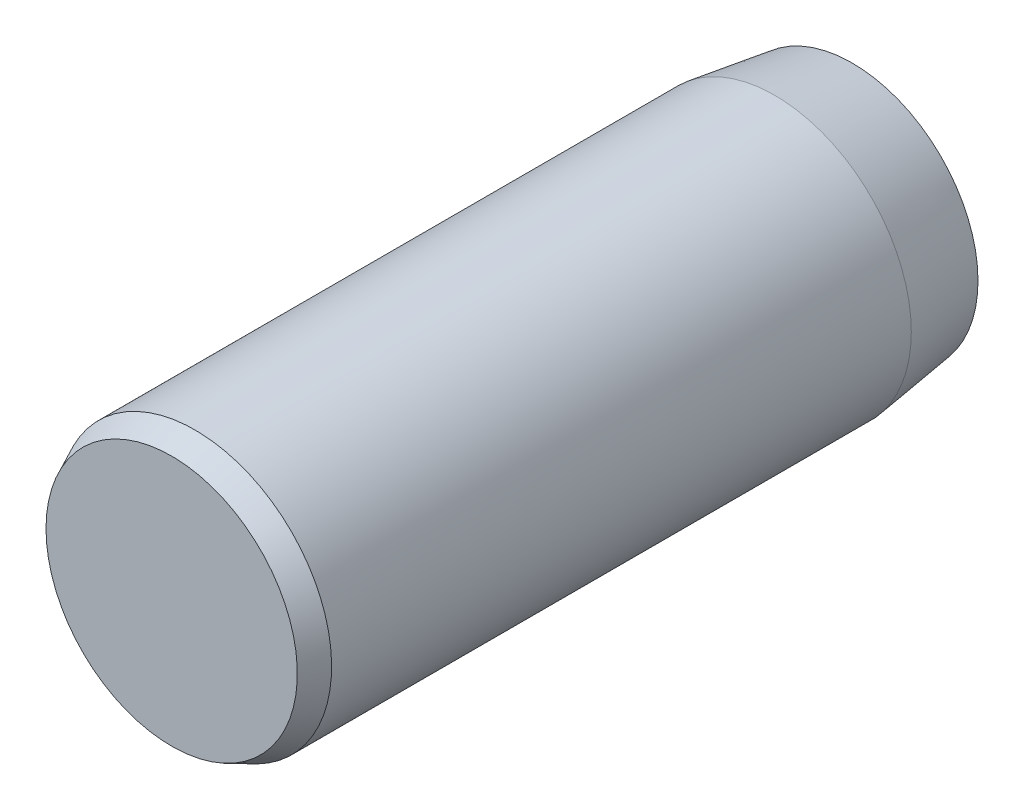
ISO-10303-21;
HEADER;
FILE_DESCRIPTION(('STEP AP214'),'2;1');
FILE_NAME('part.step','',(''),(''),'','','');
FILE_SCHEMA(('AUTOMOTIVE_DESIGN { 1 0 10303 214 1 1 1 1 }'));
ENDSEC;
DATA;
#1=APPLICATION_CONTEXT('core data for automotive mechanical design processes');
#2=APPLICATION_PROTOCOL_DEFINITION('international standard','automotive_design',2000,#1);
#3=PRODUCT_CONTEXT('',#1,'mechanical');
#4=PRODUCT('Part','Part','',(#3));
#5=PRODUCT_RELATED_PRODUCT_CATEGORY('part','',(#4));
#6=PRODUCT_DEFINITION_FORMATION('','',#4);
#7=PRODUCT_DEFINITION_CONTEXT('part definition',#1,'design');
#8=PRODUCT_DEFINITION('design','',#6,#7);
#9=PRODUCT_DEFINITION_SHAPE('','',#8);
#10=(LENGTH_UNIT() NAMED_UNIT(*) SI_UNIT(.MILLI.,.METRE.));
#11=(NAMED_UNIT(*) PLANE_ANGLE_UNIT() SI_UNIT($,.RADIAN.));
#12=(NAMED_UNIT(*) SI_UNIT($,.STERADIAN.) SOLID_ANGLE_UNIT());
#13=UNCERTAINTY_MEASURE_WITH_UNIT(LENGTH_MEASURE(1.E-05),#10,'distance_accuracy_value','');
#14=(GEOMETRIC_REPRESENTATION_CONTEXT(3) GLOBAL_UNCERTAINTY_ASSIGNED_CONTEXT((#13)) GLOBAL_UNIT_ASSIGNED_CONTEXT((#10,
#11,#12)) REPRESENTATION_CONTEXT('',''));
#15=CARTESIAN_POINT('',(0.,0.,0.));
#16=DIRECTION('',(0.,0.,1.));
#17=DIRECTION('',(1.,0.,0.));
#18=AXIS2_PLACEMENT_3D('',#15,#16,#17);
#19=CARTESIAN_POINT('',(0.,0.,0.));
#20=DIRECTION('',(0.,0.,1.));
#21=DIRECTION('',(1.,0.,0.));
#22=AXIS2_PLACEMENT_3D('',#19,#20,#21);
#23=PLANE('',#22);
#24=CARTESIAN_POINT('',(0.,0.,1.13686946141833E-10));
#25=DIRECTION('',(0.,0.,-1.));
#26=DIRECTION('',(-1.,0.,0.));
#27=AXIS2_PLACEMENT_3D('',#24,#25,#26);
#28=CIRCLE('',#27,1.46303999991915);
#29=CARTESIAN_POINT('',(-1.46303999991915,0.,1.13687045902289E-10));
#30=VERTEX_POINT('',#29);
#31=EDGE_CURVE('E18',#30,#30,#28,.T.);
#32=ORIENTED_EDGE('',*,*,#31,.F.);
#33=EDGE_LOOP('',(#32));
#34=FACE_BOUND('',#33,.T.);
#35=ADVANCED_FACE('F15',(#34),#23,.T.);
#36=CARTESIAN_POINT('',(0.,0.,-7.9248));
#37=DIRECTION('',(0.,0.,1.));
#38=DIRECTION('',(1.,0.,0.));
#39=AXIS2_PLACEMENT_3D('',#36,#37,#38);
#40=PLANE('',#39);
#41=CARTESIAN_POINT('',(0.,0.,-7.92480000001206));
#42=DIRECTION('',(0.,0.,1.));
#43=DIRECTION('',(1.,0.,0.));
#44=AXIS2_PLACEMENT_3D('',#41,#42,#43);
#45=CIRCLE('',#44,1.46304000000618);
#46=CARTESIAN_POINT('',(1.46304000000618,0.,-7.92480000001206));
#47=VERTEX_POINT('',#46);
#48=EDGE_CURVE('E27',#47,#47,#45,.T.);
#49=ORIENTED_EDGE('',*,*,#48,.F.);
#50=EDGE_LOOP('',(#49));
#51=FACE_BOUND('',#50,.T.);
#52=ADVANCED_FACE('F41',(#51),#40,.F.);
#53=CARTESIAN_POINT('',(0.,0.,-0.272352378942742));
#54=DIRECTION('',(0.,0.,-1.));
#55=DIRECTION('',(-1.,0.,0.));
#56=AXIS2_PLACEMENT_3D('',#53,#54,#55);
#57=CONICAL_SURFACE('',#56,1.59003999996798,0.436332312932511);
#58=ORIENTED_EDGE('',*,*,#31,.T.);
#59=EDGE_LOOP('',(#58));
#60=FACE_BOUND('',#59,.T.);
#61=CARTESIAN_POINT('',(0.,0.,-0.27235237890471));
#62=DIRECTION('',(0.,0.,1.));
#63=DIRECTION('',(0.,-1.,0.));
#64=AXIS2_PLACEMENT_3D('',#61,#62,#63);
#65=CIRCLE('',#64,1.59004);
#66=CARTESIAN_POINT('',(0.,-1.59004000000002,-0.27235237890471));
#67=VERTEX_POINT('',#66);
#68=EDGE_CURVE('E10',#67,#67,#65,.F.);
#69=ORIENTED_EDGE('',*,*,#68,.F.);
#70=EDGE_LOOP('',(#69));
#71=FACE_BOUND('',#70,.T.);
#72=ADVANCED_FACE('F37',(#60,#71),#57,.T.);
#73=CARTESIAN_POINT('',(0.,0.,-7.02114804528264));
#74=DIRECTION('',(0.,0.,1.));
#75=DIRECTION('',(1.,0.,0.));
#76=AXIS2_PLACEMENT_3D('',#73,#74,#75);
#77=CONICAL_SURFACE('',#76,1.59004000001062,0.139626340166404);
#78=ORIENTED_EDGE('',*,*,#48,.T.);
#79=EDGE_LOOP('',(#78));
#80=FACE_BOUND('',#79,.T.);
#81=CARTESIAN_POINT('',(0.,0.,-7.02114804525718));
#82=DIRECTION('',(0.,0.,1.));
#83=DIRECTION('',(0.,-1.,0.));
#84=AXIS2_PLACEMENT_3D('',#81,#82,#83);
#85=CIRCLE('',#84,1.59004);
#86=CARTESIAN_POINT('',(0.,-1.59004000000002,-7.02114804525718));
#87=VERTEX_POINT('',#86);
#88=EDGE_CURVE('E22',#87,#87,#85,.T.);
#89=ORIENTED_EDGE('',*,*,#88,.F.);
#90=EDGE_LOOP('',(#89));
#91=FACE_BOUND('',#90,.T.);
#92=ADVANCED_FACE('F49',(#80,#91),#77,.T.);
#93=CARTESIAN_POINT('',(0.,0.,-7.9248));
#94=DIRECTION('',(0.,0.,1.));
#95=DIRECTION('',(0.,-1.,0.));
#96=AXIS2_PLACEMENT_3D('',#93,#94,#95);
#97=CYLINDRICAL_SURFACE('',#96,1.59004);
#98=ORIENTED_EDGE('',*,*,#68,.T.);
#99=EDGE_LOOP('',(#98));
#100=FACE_BOUND('',#99,.T.);
#101=ORIENTED_EDGE('',*,*,#88,.T.);
#102=EDGE_LOOP('',(#101));
#103=FACE_BOUND('',#102,.T.);
#104=ADVANCED_FACE('F47',(#100,#103),#97,.T.);
#105=CLOSED_SHELL('',(#35,#52,#72,#92,#104));
#106=MANIFOLD_SOLID_BREP('B1',#105);
#107=ADVANCED_BREP_SHAPE_REPRESENTATION('',(#18,#106),#14);
#108=SHAPE_DEFINITION_REPRESENTATION(#9,#107);
ENDSEC;
END-ISO-10303-21;
